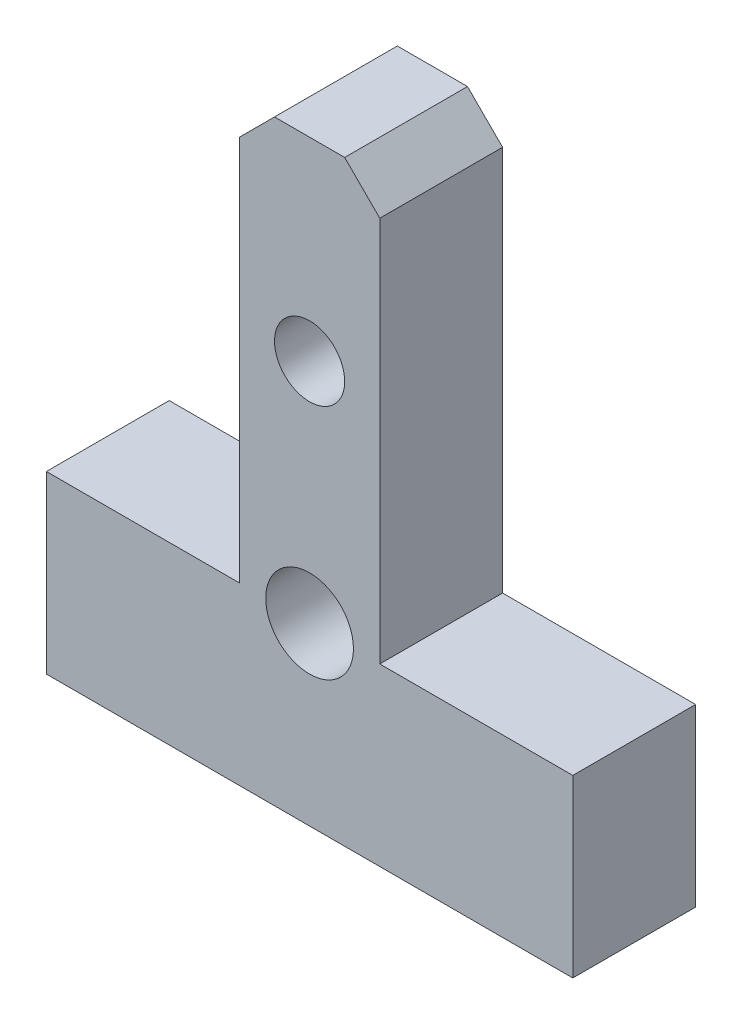
ISO-10303-21;
HEADER;
FILE_DESCRIPTION(('STEP AP214'),'2;1');
FILE_NAME('part.step','',(''),(''),'','','');
FILE_SCHEMA(('AUTOMOTIVE_DESIGN { 1 0 10303 214 1 1 1 1 }'));
ENDSEC;
DATA;
#1=APPLICATION_CONTEXT('core data for automotive mechanical design processes');
#2=APPLICATION_PROTOCOL_DEFINITION('international standard','automotive_design',2000,#1);
#3=PRODUCT_CONTEXT('',#1,'mechanical');
#4=PRODUCT('Part','Part','',(#3));
#5=PRODUCT_RELATED_PRODUCT_CATEGORY('part','',(#4));
#6=PRODUCT_DEFINITION_FORMATION('','',#4);
#7=PRODUCT_DEFINITION_CONTEXT('part definition',#1,'design');
#8=PRODUCT_DEFINITION('design','',#6,#7);
#9=PRODUCT_DEFINITION_SHAPE('','',#8);
#10=(LENGTH_UNIT() NAMED_UNIT(*) SI_UNIT(.MILLI.,.METRE.));
#11=(NAMED_UNIT(*) PLANE_ANGLE_UNIT() SI_UNIT($,.RADIAN.));
#12=(NAMED_UNIT(*) SI_UNIT($,.STERADIAN.) SOLID_ANGLE_UNIT());
#13=UNCERTAINTY_MEASURE_WITH_UNIT(LENGTH_MEASURE(1.E-05),#10,'distance_accuracy_value','');
#14=(GEOMETRIC_REPRESENTATION_CONTEXT(3) GLOBAL_UNCERTAINTY_ASSIGNED_CONTEXT((#13)) GLOBAL_UNIT_ASSIGNED_CONTEXT((#10,
#11,#12)) REPRESENTATION_CONTEXT('',''));
#15=CARTESIAN_POINT('',(0.,0.,0.));
#16=DIRECTION('',(0.,0.,1.));
#17=DIRECTION('',(1.,0.,0.));
#18=AXIS2_PLACEMENT_3D('',#15,#16,#17);
#19=CARTESIAN_POINT('',(-15.,-1.14603152196872,7.));
#20=DIRECTION('',(0.,-1.,0.));
#21=DIRECTION('',(0.,0.,-1.));
#22=AXIS2_PLACEMENT_3D('',#19,#20,#21);
#23=PLANE('',#22);
#24=DIRECTION('',(-1.,0.,0.));
#25=VECTOR('',#24,1.);
#26=CARTESIAN_POINT('',(-15.,-1.14603152196872,0.));
#27=LINE('',#26,#25);
#28=CARTESIAN_POINT('',(-4.,-1.14603152196872,0.));
#29=VERTEX_POINT('',#28);
#30=CARTESIAN_POINT('',(-15.,-1.14603152196872,0.));
#31=VERTEX_POINT('',#30);
#32=EDGE_CURVE('E133',#29,#31,#27,.T.);
#33=ORIENTED_EDGE('',*,*,#32,.T.);
#34=DIRECTION('',(0.,0.,-1.));
#35=VECTOR('',#34,1.);
#36=CARTESIAN_POINT('',(-15.,-1.14603152196872,7.));
#37=LINE('',#36,#35);
#38=CARTESIAN_POINT('',(-15.,-1.14603152196872,7.));
#39=VERTEX_POINT('',#38);
#40=EDGE_CURVE('E114',#39,#31,#37,.T.);
#41=ORIENTED_EDGE('',*,*,#40,.F.);
#42=DIRECTION('',(-1.,0.,0.));
#43=VECTOR('',#42,1.);
#44=CARTESIAN_POINT('',(-15.,-1.14603152196872,7.));
#45=LINE('',#44,#43);
#46=CARTESIAN_POINT('',(-4.,-1.14603152196872,7.));
#47=VERTEX_POINT('',#46);
#48=EDGE_CURVE('E121',#47,#39,#45,.T.);
#49=ORIENTED_EDGE('',*,*,#48,.F.);
#50=DIRECTION('',(0.,0.,-1.));
#51=VECTOR('',#50,1.);
#52=CARTESIAN_POINT('',(-4.,-1.14603152196872,7.));
#53=LINE('',#52,#51);
#54=EDGE_CURVE('E165',#47,#29,#53,.T.);
#55=ORIENTED_EDGE('',*,*,#54,.T.);
#56=EDGE_LOOP('',(#33,#41,#49,#55));
#57=FACE_BOUND('',#56,.T.);
#58=ADVANCED_FACE('F32',(#57),#23,.F.);
#59=CARTESIAN_POINT('',(-15.,-1.14603152196872,7.));
#60=DIRECTION('',(1.,0.,0.));
#61=DIRECTION('',(0.,0.,-1.));
#62=AXIS2_PLACEMENT_3D('',#59,#60,#61);
#63=PLANE('',#62);
#64=DIRECTION('',(0.,-1.,0.));
#65=VECTOR('',#64,1.);
#66=CARTESIAN_POINT('',(-15.,-1.14603152196872,0.));
#67=LINE('',#66,#65);
#68=CARTESIAN_POINT('',(-15.,-11.1460315219687,0.));
#69=VERTEX_POINT('',#68);
#70=EDGE_CURVE('E176',#31,#69,#67,.T.);
#71=ORIENTED_EDGE('',*,*,#70,.T.);
#72=DIRECTION('',(0.,0.,-1.));
#73=VECTOR('',#72,1.);
#74=CARTESIAN_POINT('',(-15.,-11.1460315219687,7.));
#75=LINE('',#74,#73);
#76=CARTESIAN_POINT('',(-15.,-11.1460315219687,7.));
#77=VERTEX_POINT('',#76);
#78=EDGE_CURVE('E117',#77,#69,#75,.T.);
#79=ORIENTED_EDGE('',*,*,#78,.F.);
#80=DIRECTION('',(0.,-1.,0.));
#81=VECTOR('',#80,1.);
#82=CARTESIAN_POINT('',(-15.,-1.14603152196872,7.));
#83=LINE('',#82,#81);
#84=EDGE_CURVE('E110',#39,#77,#83,.T.);
#85=ORIENTED_EDGE('',*,*,#84,.F.);
#86=ORIENTED_EDGE('',*,*,#40,.T.);
#87=EDGE_LOOP('',(#71,#79,#85,#86));
#88=FACE_BOUND('',#87,.T.);
#89=ADVANCED_FACE('F112',(#88),#63,.F.);
#90=CARTESIAN_POINT('',(-15.,-11.1460315219687,7.));
#91=DIRECTION('',(0.,1.,0.));
#92=DIRECTION('',(0.,0.,1.));
#93=AXIS2_PLACEMENT_3D('',#90,#91,#92);
#94=PLANE('',#93);
#95=DIRECTION('',(1.,0.,0.));
#96=VECTOR('',#95,1.);
#97=CARTESIAN_POINT('',(-15.,-11.1460315219687,0.));
#98=LINE('',#97,#96);
#99=CARTESIAN_POINT('',(15.,-11.1460315219687,0.));
#100=VERTEX_POINT('',#99);
#101=EDGE_CURVE('E178',#69,#100,#98,.T.);
#102=ORIENTED_EDGE('',*,*,#101,.T.);
#103=DIRECTION('',(0.,0.,-1.));
#104=VECTOR('',#103,1.);
#105=CARTESIAN_POINT('',(15.,-11.1460315219687,7.));
#106=LINE('',#105,#104);
#107=CARTESIAN_POINT('',(15.,-11.1460315219687,7.));
#108=VERTEX_POINT('',#107);
#109=EDGE_CURVE('E139',#108,#100,#106,.T.);
#110=ORIENTED_EDGE('',*,*,#109,.F.);
#111=DIRECTION('',(1.,0.,0.));
#112=VECTOR('',#111,1.);
#113=CARTESIAN_POINT('',(-15.,-11.1460315219687,7.));
#114=LINE('',#113,#112);
#115=EDGE_CURVE('E120',#77,#108,#114,.T.);
#116=ORIENTED_EDGE('',*,*,#115,.F.);
#117=ORIENTED_EDGE('',*,*,#78,.T.);
#118=EDGE_LOOP('',(#102,#110,#116,#117));
#119=FACE_BOUND('',#118,.T.);
#120=ADVANCED_FACE('F222',(#119),#94,.F.);
#121=CARTESIAN_POINT('',(15.,-1.14603152196872,7.));
#122=DIRECTION('',(-1.,0.,0.));
#123=DIRECTION('',(0.,0.,1.));
#124=AXIS2_PLACEMENT_3D('',#121,#122,#123);
#125=PLANE('',#124);
#126=DIRECTION('',(0.,1.,0.));
#127=VECTOR('',#126,1.);
#128=CARTESIAN_POINT('',(15.,-1.14603152196872,0.));
#129=LINE('',#128,#127);
#130=CARTESIAN_POINT('',(15.,-1.14603152196872,0.));
#131=VERTEX_POINT('',#130);
#132=EDGE_CURVE('E180',#100,#131,#129,.T.);
#133=ORIENTED_EDGE('',*,*,#132,.T.);
#134=DIRECTION('',(0.,0.,-1.));
#135=VECTOR('',#134,1.);
#136=CARTESIAN_POINT('',(15.,-1.14603152196872,7.));
#137=LINE('',#136,#135);
#138=CARTESIAN_POINT('',(15.,-1.14603152196872,7.));
#139=VERTEX_POINT('',#138);
#140=EDGE_CURVE('E189',#139,#131,#137,.T.);
#141=ORIENTED_EDGE('',*,*,#140,.F.);
#142=DIRECTION('',(0.,1.,0.));
#143=VECTOR('',#142,1.);
#144=CARTESIAN_POINT('',(15.,-1.14603152196872,7.));
#145=LINE('',#144,#143);
#146=EDGE_CURVE('E198',#108,#139,#145,.T.);
#147=ORIENTED_EDGE('',*,*,#146,.F.);
#148=ORIENTED_EDGE('',*,*,#109,.T.);
#149=EDGE_LOOP('',(#133,#141,#147,#148));
#150=FACE_BOUND('',#149,.T.);
#151=ADVANCED_FACE('F196',(#150),#125,.F.);
#152=CARTESIAN_POINT('',(15.,-1.14603152196872,7.));
#153=DIRECTION('',(0.,-1.,0.));
#154=DIRECTION('',(1.,0.,0.));
#155=AXIS2_PLACEMENT_3D('',#152,#153,#154);
#156=PLANE('',#155);
#157=DIRECTION('',(-1.,0.,0.));
#158=VECTOR('',#157,1.);
#159=CARTESIAN_POINT('',(15.,-1.14603152196872,0.));
#160=LINE('',#159,#158);
#161=CARTESIAN_POINT('',(4.,-1.14603152196872,0.));
#162=VERTEX_POINT('',#161);
#163=EDGE_CURVE('E182',#131,#162,#160,.T.);
#164=ORIENTED_EDGE('',*,*,#163,.T.);
#165=DIRECTION('',(0.,0.,-1.));
#166=VECTOR('',#165,1.);
#167=CARTESIAN_POINT('',(4.,-1.14603152196872,7.));
#168=LINE('',#167,#166);
#169=CARTESIAN_POINT('',(4.,-1.14603152196872,7.));
#170=VERTEX_POINT('',#169);
#171=EDGE_CURVE('E168',#170,#162,#168,.T.);
#172=ORIENTED_EDGE('',*,*,#171,.F.);
#173=DIRECTION('',(-1.,0.,0.));
#174=VECTOR('',#173,1.);
#175=CARTESIAN_POINT('',(15.,-1.14603152196872,7.));
#176=LINE('',#175,#174);
#177=EDGE_CURVE('E171',#139,#170,#176,.T.);
#178=ORIENTED_EDGE('',*,*,#177,.F.);
#179=ORIENTED_EDGE('',*,*,#140,.T.);
#180=EDGE_LOOP('',(#164,#172,#178,#179));
#181=FACE_BOUND('',#180,.T.);
#182=ADVANCED_FACE('F204',(#181),#156,.F.);
#183=CARTESIAN_POINT('',(4.,-1.14603152196872,7.));
#184=DIRECTION('',(-1.,0.,0.));
#185=DIRECTION('',(0.,-1.,0.));
#186=AXIS2_PLACEMENT_3D('',#183,#184,#185);
#187=PLANE('',#186);
#188=DIRECTION('',(0.,1.,0.));
#189=VECTOR('',#188,1.);
#190=CARTESIAN_POINT('',(4.,-1.14603152196872,0.));
#191=LINE('',#190,#189);
#192=CARTESIAN_POINT('',(3.99999999999999,20.8539684780313,0.));
#193=VERTEX_POINT('',#192);
#194=EDGE_CURVE('E184',#162,#193,#191,.T.);
#195=ORIENTED_EDGE('',*,*,#194,.T.);
#196=DIRECTION('',(0.,0.,1.));
#197=VECTOR('',#196,1.);
#198=CARTESIAN_POINT('',(3.99999999999999,20.8539684780313,7.));
#199=LINE('',#198,#197);
#200=CARTESIAN_POINT('',(3.99999999999999,20.8539684780313,7.));
#201=VERTEX_POINT('',#200);
#202=EDGE_CURVE('E11',#193,#201,#199,.T.);
#203=ORIENTED_EDGE('',*,*,#202,.T.);
#204=DIRECTION('',(0.,1.,0.));
#205=VECTOR('',#204,1.);
#206=CARTESIAN_POINT('',(4.,-1.14603152196872,7.));
#207=LINE('',#206,#205);
#208=EDGE_CURVE('E166',#170,#201,#207,.T.);
#209=ORIENTED_EDGE('',*,*,#208,.F.);
#210=ORIENTED_EDGE('',*,*,#171,.T.);
#211=EDGE_LOOP('',(#195,#203,#209,#210));
#212=FACE_BOUND('',#211,.T.);
#213=ADVANCED_FACE('F208',(#212),#187,.F.);
#214=CARTESIAN_POINT('',(-4.,-1.14603152196872,7.));
#215=DIRECTION('',(1.,0.,0.));
#216=DIRECTION('',(0.,0.,-1.));
#217=AXIS2_PLACEMENT_3D('',#214,#215,#216);
#218=PLANE('',#217);
#219=DIRECTION('',(0.,-1.,0.));
#220=VECTOR('',#219,1.);
#221=CARTESIAN_POINT('',(-4.,-1.14603152196872,7.));
#222=LINE('',#221,#220);
#223=CARTESIAN_POINT('',(-4.,20.8539684780313,7.));
#224=VERTEX_POINT('',#223);
#225=EDGE_CURVE('E126',#224,#47,#222,.T.);
#226=ORIENTED_EDGE('',*,*,#225,.F.);
#227=DIRECTION('',(0.,0.,-1.));
#228=VECTOR('',#227,1.);
#229=CARTESIAN_POINT('',(-4.,20.8539684780313,0.));
#230=LINE('',#229,#228);
#231=CARTESIAN_POINT('',(-4.,20.8539684780313,0.));
#232=VERTEX_POINT('',#231);
#233=EDGE_CURVE('E55',#224,#232,#230,.T.);
#234=ORIENTED_EDGE('',*,*,#233,.T.);
#235=DIRECTION('',(0.,-1.,0.));
#236=VECTOR('',#235,1.);
#237=CARTESIAN_POINT('',(-4.,-1.14603152196872,0.));
#238=LINE('',#237,#236);
#239=EDGE_CURVE('E130',#232,#29,#238,.T.);
#240=ORIENTED_EDGE('',*,*,#239,.T.);
#241=ORIENTED_EDGE('',*,*,#54,.F.);
#242=EDGE_LOOP('',(#226,#234,#240,#241));
#243=FACE_BOUND('',#242,.T.);
#244=ADVANCED_FACE('F164',(#243),#218,.F.);
#245=CARTESIAN_POINT('',(-4.,-1.14603152196872,7.));
#246=DIRECTION('',(0.,0.,1.));
#247=DIRECTION('',(1.,0.,0.));
#248=AXIS2_PLACEMENT_3D('',#245,#246,#247);
#249=PLANE('',#248);
#250=CARTESIAN_POINT('',(4.16010810869172E-08,11.7946243947109,7.));
#251=DIRECTION('',(0.,0.,1.));
#252=DIRECTION('',(1.,0.,0.));
#253=AXIS2_PLACEMENT_3D('',#250,#251,#252);
#254=CIRCLE('',#253,1.99999999059397);
#255=CARTESIAN_POINT('',(2.00000003219505,11.7946243947109,7.));
#256=VERTEX_POINT('',#255);
#257=EDGE_CURVE('E257',#256,#256,#254,.T.);
#258=ORIENTED_EDGE('',*,*,#257,.F.);
#259=EDGE_LOOP('',(#258));
#260=FACE_BOUND('',#259,.T.);
#261=CARTESIAN_POINT('',(0.,-1.14603176973458,7.));
#262=DIRECTION('',(0.,0.,1.));
#263=DIRECTION('',(1.,0.,0.));
#264=AXIS2_PLACEMENT_3D('',#261,#262,#263);
#265=CIRCLE('',#264,2.5);
#266=CARTESIAN_POINT('',(2.5,-1.14603176973458,7.));
#267=VERTEX_POINT('',#266);
#268=EDGE_CURVE('E259',#267,#267,#265,.T.);
#269=ORIENTED_EDGE('',*,*,#268,.F.);
#270=EDGE_LOOP('',(#269));
#271=FACE_BOUND('',#270,.T.);
#272=DIRECTION('',(1.,0.,0.));
#273=VECTOR('',#272,1.);
#274=CARTESIAN_POINT('',(-4.,22.8539684780313,7.));
#275=LINE('',#274,#273);
#276=CARTESIAN_POINT('',(-2.00000000000001,22.8539684780313,7.));
#277=VERTEX_POINT('',#276);
#278=CARTESIAN_POINT('',(1.99999999999999,22.8539684780313,7.));
#279=VERTEX_POINT('',#278);
#280=EDGE_CURVE('E160',#277,#279,#275,.T.);
#281=ORIENTED_EDGE('',*,*,#280,.F.);
#282=DIRECTION('',(-0.707106781186546,-0.707106781186549,0.));
#283=VECTOR('',#282,1.);
#284=CARTESIAN_POINT('',(-15.,9.85396847803124,7.));
#285=LINE('',#284,#283);
#286=EDGE_CURVE('E147',#277,#224,#285,.T.);
#287=ORIENTED_EDGE('',*,*,#286,.T.);
#288=ORIENTED_EDGE('',*,*,#225,.T.);
#289=ORIENTED_EDGE('',*,*,#48,.T.);
#290=ORIENTED_EDGE('',*,*,#84,.T.);
#291=ORIENTED_EDGE('',*,*,#115,.T.);
#292=ORIENTED_EDGE('',*,*,#146,.T.);
#293=ORIENTED_EDGE('',*,*,#177,.T.);
#294=ORIENTED_EDGE('',*,*,#208,.T.);
#295=DIRECTION('',(-0.707106781186546,0.707106781186549,0.));
#296=VECTOR('',#295,1.);
#297=CARTESIAN_POINT('',(11.,13.8539684780312,7.));
#298=LINE('',#297,#296);
#299=EDGE_CURVE('E145',#201,#279,#298,.T.);
#300=ORIENTED_EDGE('',*,*,#299,.T.);
#301=EDGE_LOOP('',(#281,#287,#288,#289,#290,#291,#292,#293,#294,#300));
#302=FACE_BOUND('',#301,.T.);
#303=ADVANCED_FACE('F125',(#260,#271,#302),#249,.T.);
#304=CARTESIAN_POINT('',(-4.,-1.14603152196872,0.));
#305=DIRECTION('',(0.,0.,1.));
#306=DIRECTION('',(1.,0.,0.));
#307=AXIS2_PLACEMENT_3D('',#304,#305,#306);
#308=PLANE('',#307);
#309=CARTESIAN_POINT('',(4.16010810869172E-08,11.7946243947109,0.));
#310=DIRECTION('',(0.,0.,1.));
#311=DIRECTION('',(1.,0.,0.));
#312=AXIS2_PLACEMENT_3D('',#309,#310,#311);
#313=CIRCLE('',#312,1.99999999059397);
#314=CARTESIAN_POINT('',(2.00000003219505,11.7946243947109,0.));
#315=VERTEX_POINT('',#314);
#316=EDGE_CURVE('E254',#315,#315,#313,.T.);
#317=ORIENTED_EDGE('',*,*,#316,.T.);
#318=EDGE_LOOP('',(#317));
#319=FACE_BOUND('',#318,.T.);
#320=CARTESIAN_POINT('',(0.,-1.14603176973458,0.));
#321=DIRECTION('',(0.,0.,1.));
#322=DIRECTION('',(1.,0.,0.));
#323=AXIS2_PLACEMENT_3D('',#320,#321,#322);
#324=CIRCLE('',#323,2.5);
#325=CARTESIAN_POINT('',(2.5,-1.14603176973458,0.));
#326=VERTEX_POINT('',#325);
#327=EDGE_CURVE('E161',#326,#326,#324,.T.);
#328=ORIENTED_EDGE('',*,*,#327,.T.);
#329=EDGE_LOOP('',(#328));
#330=FACE_BOUND('',#329,.T.);
#331=ORIENTED_EDGE('',*,*,#239,.F.);
#332=DIRECTION('',(0.707106781186546,0.707106781186549,0.));
#333=VECTOR('',#332,1.);
#334=CARTESIAN_POINT('',(-2.00000000000001,22.8539684780313,0.));
#335=LINE('',#334,#333);
#336=CARTESIAN_POINT('',(-2.00000000000001,22.8539684780313,0.));
#337=VERTEX_POINT('',#336);
#338=EDGE_CURVE('E40',#232,#337,#335,.T.);
#339=ORIENTED_EDGE('',*,*,#338,.T.);
#340=DIRECTION('',(-1.,0.,0.));
#341=VECTOR('',#340,1.);
#342=CARTESIAN_POINT('',(-4.00000000000001,22.8539684780313,0.));
#343=LINE('',#342,#341);
#344=CARTESIAN_POINT('',(2.,22.8539684780313,0.));
#345=VERTEX_POINT('',#344);
#346=EDGE_CURVE('E153',#345,#337,#343,.T.);
#347=ORIENTED_EDGE('',*,*,#346,.F.);
#348=DIRECTION('',(0.707106781186546,-0.707106781186549,0.));
#349=VECTOR('',#348,1.);
#350=CARTESIAN_POINT('',(2.,22.8539684780313,0.));
#351=LINE('',#350,#349);
#352=EDGE_CURVE('E47',#345,#193,#351,.T.);
#353=ORIENTED_EDGE('',*,*,#352,.T.);
#354=ORIENTED_EDGE('',*,*,#194,.F.);
#355=ORIENTED_EDGE('',*,*,#163,.F.);
#356=ORIENTED_EDGE('',*,*,#132,.F.);
#357=ORIENTED_EDGE('',*,*,#101,.F.);
#358=ORIENTED_EDGE('',*,*,#70,.F.);
#359=ORIENTED_EDGE('',*,*,#32,.F.);
#360=EDGE_LOOP('',(#331,#339,#347,#353,#354,#355,#356,#357,#358,#359));
#361=FACE_BOUND('',#360,.T.);
#362=ADVANCED_FACE('F152',(#319,#330,#361),#308,.F.);
#363=CARTESIAN_POINT('',(4.,22.8539684780313,7.));
#364=DIRECTION('',(0.,1.,0.));
#365=DIRECTION('',(0.,0.,1.));
#366=AXIS2_PLACEMENT_3D('',#363,#364,#365);
#367=PLANE('',#366);
#368=ORIENTED_EDGE('',*,*,#346,.T.);
#369=DIRECTION('',(0.,0.,1.));
#370=VECTOR('',#369,1.);
#371=CARTESIAN_POINT('',(-2.00000000000001,22.8539684780313,7.));
#372=LINE('',#371,#370);
#373=EDGE_CURVE('E137',#337,#277,#372,.T.);
#374=ORIENTED_EDGE('',*,*,#373,.T.);
#375=ORIENTED_EDGE('',*,*,#280,.T.);
#376=DIRECTION('',(0.,0.,-1.));
#377=VECTOR('',#376,1.);
#378=CARTESIAN_POINT('',(2.,22.8539684780313,0.));
#379=LINE('',#378,#377);
#380=EDGE_CURVE('E134',#279,#345,#379,.T.);
#381=ORIENTED_EDGE('',*,*,#380,.T.);
#382=EDGE_LOOP('',(#368,#374,#375,#381));
#383=FACE_BOUND('',#382,.T.);
#384=ADVANCED_FACE('F157',(#383),#367,.T.);
#385=CARTESIAN_POINT('',(0.,-1.14603176973458,0.));
#386=DIRECTION('',(0.,0.,1.));
#387=DIRECTION('',(1.,0.,0.));
#388=AXIS2_PLACEMENT_3D('',#385,#386,#387);
#389=CYLINDRICAL_SURFACE('',#388,2.5);
#390=ORIENTED_EDGE('',*,*,#327,.F.);
#391=EDGE_LOOP('',(#390));
#392=FACE_BOUND('',#391,.T.);
#393=ORIENTED_EDGE('',*,*,#268,.T.);
#394=EDGE_LOOP('',(#393));
#395=FACE_BOUND('',#394,.T.);
#396=ADVANCED_FACE('F243',(#392,#395),#389,.F.);
#397=CARTESIAN_POINT('',(4.16010810869172E-08,11.7946243947109,0.));
#398=DIRECTION('',(0.,0.,1.));
#399=DIRECTION('',(1.,0.,0.));
#400=AXIS2_PLACEMENT_3D('',#397,#398,#399);
#401=CYLINDRICAL_SURFACE('',#400,1.99999999059397);
#402=ORIENTED_EDGE('',*,*,#316,.F.);
#403=EDGE_LOOP('',(#402));
#404=FACE_BOUND('',#403,.T.);
#405=ORIENTED_EDGE('',*,*,#257,.T.);
#406=EDGE_LOOP('',(#405));
#407=FACE_BOUND('',#406,.T.);
#408=ADVANCED_FACE('F216',(#404,#407),#401,.F.);
#409=CARTESIAN_POINT('',(-2.00000000000001,22.8539684780313,7.));
#410=DIRECTION('',(-0.707106781186549,0.707106781186546,0.));
#411=DIRECTION('',(-0.707106781186546,-0.707106781186549,0.));
#412=AXIS2_PLACEMENT_3D('',#409,#410,#411);
#413=PLANE('',#412);
#414=ORIENTED_EDGE('',*,*,#338,.F.);
#415=ORIENTED_EDGE('',*,*,#233,.F.);
#416=ORIENTED_EDGE('',*,*,#286,.F.);
#417=ORIENTED_EDGE('',*,*,#373,.F.);
#418=EDGE_LOOP('',(#414,#415,#416,#417));
#419=FACE_BOUND('',#418,.T.);
#420=ADVANCED_FACE('F163',(#419),#413,.T.);
#421=CARTESIAN_POINT('',(2.,22.8539684780313,7.));
#422=DIRECTION('',(0.707106781186549,0.707106781186546,0.));
#423=DIRECTION('',(-0.707106781186546,0.707106781186549,0.));
#424=AXIS2_PLACEMENT_3D('',#421,#422,#423);
#425=PLANE('',#424);
#426=ORIENTED_EDGE('',*,*,#299,.F.);
#427=ORIENTED_EDGE('',*,*,#202,.F.);
#428=ORIENTED_EDGE('',*,*,#352,.F.);
#429=ORIENTED_EDGE('',*,*,#380,.F.);
#430=EDGE_LOOP('',(#426,#427,#428,#429));
#431=FACE_BOUND('',#430,.T.);
#432=ADVANCED_FACE('F34',(#431),#425,.T.);
#433=CLOSED_SHELL('',(#58,#89,#120,#151,#182,#213,#244,#303,#362,#384,#396,#408,#420,#432));
#434=MANIFOLD_SOLID_BREP('B2',#433);
#435=ADVANCED_BREP_SHAPE_REPRESENTATION('',(#18,#434),#14);
#436=SHAPE_DEFINITION_REPRESENTATION(#9,#435);
ENDSEC;
END-ISO-10303-21;
